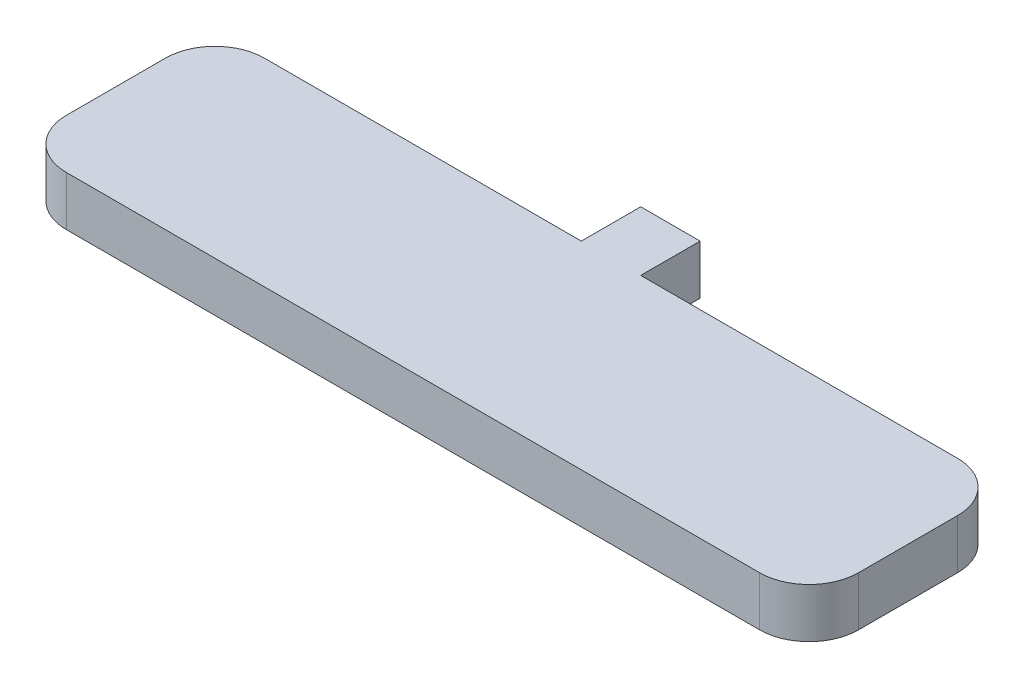
ISO-10303-21;
HEADER;
FILE_DESCRIPTION(('STEP AP214'),'2;1');
FILE_NAME('part.step','',(''),(''),'','','');
FILE_SCHEMA(('AUTOMOTIVE_DESIGN { 1 0 10303 214 1 1 1 1 }'));
ENDSEC;
DATA;
#1=APPLICATION_CONTEXT('core data for automotive mechanical design processes');
#2=APPLICATION_PROTOCOL_DEFINITION('international standard','automotive_design',2000,#1);
#3=PRODUCT_CONTEXT('',#1,'mechanical');
#4=PRODUCT('Part','Part','',(#3));
#5=PRODUCT_RELATED_PRODUCT_CATEGORY('part','',(#4));
#6=PRODUCT_DEFINITION_FORMATION('','',#4);
#7=PRODUCT_DEFINITION_CONTEXT('part definition',#1,'design');
#8=PRODUCT_DEFINITION('design','',#6,#7);
#9=PRODUCT_DEFINITION_SHAPE('','',#8);
#10=(LENGTH_UNIT() NAMED_UNIT(*) SI_UNIT(.MILLI.,.METRE.));
#11=(NAMED_UNIT(*) PLANE_ANGLE_UNIT() SI_UNIT($,.RADIAN.));
#12=(NAMED_UNIT(*) SI_UNIT($,.STERADIAN.) SOLID_ANGLE_UNIT());
#13=UNCERTAINTY_MEASURE_WITH_UNIT(LENGTH_MEASURE(1.E-05),#10,'distance_accuracy_value','');
#14=(GEOMETRIC_REPRESENTATION_CONTEXT(3) GLOBAL_UNCERTAINTY_ASSIGNED_CONTEXT((#13)) GLOBAL_UNIT_ASSIGNED_CONTEXT((#10,
#11,#12)) REPRESENTATION_CONTEXT('',''));
#15=CARTESIAN_POINT('',(0.,0.,0.));
#16=DIRECTION('',(0.,0.,1.));
#17=DIRECTION('',(1.,0.,0.));
#18=AXIS2_PLACEMENT_3D('',#15,#16,#17);
#19=CARTESIAN_POINT('',(-40.,5.,-10.));
#20=DIRECTION('',(0.,0.,1.));
#21=DIRECTION('',(1.,0.,0.));
#22=AXIS2_PLACEMENT_3D('',#19,#20,#21);
#23=PLANE('',#22);
#24=DIRECTION('',(0.,1.,0.));
#25=VECTOR('',#24,1.);
#26=CARTESIAN_POINT('',(-3.,4.99999999999999,-10.));
#27=LINE('',#26,#25);
#28=CARTESIAN_POINT('',(-3.,0.,-10.));
#29=VERTEX_POINT('',#28);
#30=CARTESIAN_POINT('',(-3.,5.,-10.));
#31=VERTEX_POINT('',#30);
#32=EDGE_CURVE('E55',#29,#31,#27,.T.);
#33=ORIENTED_EDGE('',*,*,#32,.F.);
#34=DIRECTION('',(-1.,0.,0.));
#35=VECTOR('',#34,1.);
#36=CARTESIAN_POINT('',(-40.,0.,-10.));
#37=LINE('',#36,#35);
#38=CARTESIAN_POINT('',(-35.,0.,-10.));
#39=VERTEX_POINT('',#38);
#40=EDGE_CURVE('E307',#29,#39,#37,.T.);
#41=ORIENTED_EDGE('',*,*,#40,.T.);
#42=DIRECTION('',(0.,-1.,0.));
#43=VECTOR('',#42,1.);
#44=CARTESIAN_POINT('',(-35.,5.,-10.));
#45=LINE('',#44,#43);
#46=CARTESIAN_POINT('',(-35.,5.,-10.));
#47=VERTEX_POINT('',#46);
#48=EDGE_CURVE('E342',#39,#47,#45,.F.);
#49=ORIENTED_EDGE('',*,*,#48,.T.);
#50=DIRECTION('',(-1.,0.,0.));
#51=VECTOR('',#50,1.);
#52=CARTESIAN_POINT('',(-40.,5.,-10.));
#53=LINE('',#52,#51);
#54=EDGE_CURVE('E290',#31,#47,#53,.T.);
#55=ORIENTED_EDGE('',*,*,#54,.F.);
#56=EDGE_LOOP('',(#33,#41,#49,#55));
#57=FACE_BOUND('',#56,.T.);
#58=ADVANCED_FACE('F39',(#57),#23,.F.);
#59=DIRECTION('',(0.,-1.,0.));
#60=VECTOR('',#59,1.);
#61=CARTESIAN_POINT('',(3.,4.99999999999999,-10.));
#62=LINE('',#61,#60);
#63=CARTESIAN_POINT('',(3.,4.99999999999999,-10.));
#64=VERTEX_POINT('',#63);
#65=CARTESIAN_POINT('',(3.,0.,-10.));
#66=VERTEX_POINT('',#65);
#67=EDGE_CURVE('E197',#64,#66,#62,.T.);
#68=ORIENTED_EDGE('',*,*,#67,.F.);
#69=CARTESIAN_POINT('',(35.,5.,-10.));
#70=VERTEX_POINT('',#69);
#71=EDGE_CURVE('E292',#70,#64,#53,.T.);
#72=ORIENTED_EDGE('',*,*,#71,.F.);
#73=DIRECTION('',(0.,-1.,0.));
#74=VECTOR('',#73,1.);
#75=CARTESIAN_POINT('',(35.,5.,-10.));
#76=LINE('',#75,#74);
#77=CARTESIAN_POINT('',(35.,0.,-10.));
#78=VERTEX_POINT('',#77);
#79=EDGE_CURVE('E338',#70,#78,#76,.T.);
#80=ORIENTED_EDGE('',*,*,#79,.T.);
#81=EDGE_CURVE('E308',#78,#66,#37,.T.);
#82=ORIENTED_EDGE('',*,*,#81,.T.);
#83=EDGE_LOOP('',(#68,#72,#80,#82));
#84=FACE_BOUND('',#83,.T.);
#85=ADVANCED_FACE('F388',(#84),#23,.F.);
#86=CARTESIAN_POINT('',(0.,0.,0.));
#87=DIRECTION('',(0.,1.,0.));
#88=DIRECTION('',(0.,0.,1.));
#89=AXIS2_PLACEMENT_3D('',#86,#87,#88);
#90=PLANE('',#89);
#91=DIRECTION('',(0.,0.,1.));
#92=VECTOR('',#91,1.);
#93=CARTESIAN_POINT('',(-40.,0.,-10.));
#94=LINE('',#93,#92);
#95=CARTESIAN_POINT('',(-40.,0.,-5.00000000000001));
#96=VERTEX_POINT('',#95);
#97=CARTESIAN_POINT('',(-40.,0.,4.99999999999999));
#98=VERTEX_POINT('',#97);
#99=EDGE_CURVE('E312',#96,#98,#94,.T.);
#100=ORIENTED_EDGE('',*,*,#99,.F.);
#101=CARTESIAN_POINT('',(-35.,0.,-5.00000000000001));
#102=DIRECTION('',(0.,1.,0.));
#103=DIRECTION('',(0.,0.,1.));
#104=AXIS2_PLACEMENT_3D('',#101,#102,#103);
#105=CIRCLE('',#104,5.);
#106=EDGE_CURVE('E334',#96,#39,#105,.F.);
#107=ORIENTED_EDGE('',*,*,#106,.T.);
#108=ORIENTED_EDGE('',*,*,#40,.F.);
#109=DIRECTION('',(0.,0.,1.));
#110=VECTOR('',#109,1.);
#111=CARTESIAN_POINT('',(-3.,0.,-16.));
#112=LINE('',#111,#110);
#113=CARTESIAN_POINT('',(-3.,0.,-16.));
#114=VERTEX_POINT('',#113);
#115=EDGE_CURVE('E407',#114,#29,#112,.T.);
#116=ORIENTED_EDGE('',*,*,#115,.F.);
#117=DIRECTION('',(-1.,0.,0.));
#118=VECTOR('',#117,1.);
#119=CARTESIAN_POINT('',(-3.,0.,-16.));
#120=LINE('',#119,#118);
#121=CARTESIAN_POINT('',(3.,0.,-16.));
#122=VERTEX_POINT('',#121);
#123=EDGE_CURVE('E194',#122,#114,#120,.T.);
#124=ORIENTED_EDGE('',*,*,#123,.F.);
#125=DIRECTION('',(0.,0.,1.));
#126=VECTOR('',#125,1.);
#127=CARTESIAN_POINT('',(3.,0.,-16.));
#128=LINE('',#127,#126);
#129=EDGE_CURVE('E208',#122,#66,#128,.T.);
#130=ORIENTED_EDGE('',*,*,#129,.T.);
#131=ORIENTED_EDGE('',*,*,#81,.F.);
#132=CARTESIAN_POINT('',(35.,0.,-5.00000000000001));
#133=DIRECTION('',(0.,1.,0.));
#134=DIRECTION('',(0.,0.,1.));
#135=AXIS2_PLACEMENT_3D('',#132,#133,#134);
#136=CIRCLE('',#135,5.);
#137=CARTESIAN_POINT('',(40.,0.,-5.00000000000001));
#138=VERTEX_POINT('',#137);
#139=EDGE_CURVE('E328',#78,#138,#136,.F.);
#140=ORIENTED_EDGE('',*,*,#139,.T.);
#141=DIRECTION('',(0.,0.,-1.));
#142=VECTOR('',#141,1.);
#143=CARTESIAN_POINT('',(40.,0.,-10.));
#144=LINE('',#143,#142);
#145=CARTESIAN_POINT('',(40.,0.,5.));
#146=VERTEX_POINT('',#145);
#147=EDGE_CURVE('E215',#146,#138,#144,.T.);
#148=ORIENTED_EDGE('',*,*,#147,.F.);
#149=CARTESIAN_POINT('',(35.,0.,4.99999999999999));
#150=DIRECTION('',(0.,1.,0.));
#151=DIRECTION('',(0.,0.,1.));
#152=AXIS2_PLACEMENT_3D('',#149,#150,#151);
#153=CIRCLE('',#152,5.);
#154=CARTESIAN_POINT('',(35.,0.,9.99999999999999));
#155=VERTEX_POINT('',#154);
#156=EDGE_CURVE('E325',#146,#155,#153,.F.);
#157=ORIENTED_EDGE('',*,*,#156,.T.);
#158=DIRECTION('',(1.,0.,0.));
#159=VECTOR('',#158,1.);
#160=CARTESIAN_POINT('',(-40.,0.,9.99999999999999));
#161=LINE('',#160,#159);
#162=CARTESIAN_POINT('',(-35.,0.,9.99999999999999));
#163=VERTEX_POINT('',#162);
#164=EDGE_CURVE('E291',#163,#155,#161,.T.);
#165=ORIENTED_EDGE('',*,*,#164,.F.);
#166=CARTESIAN_POINT('',(-35.,0.,4.99999999999999));
#167=DIRECTION('',(0.,1.,0.));
#168=DIRECTION('',(0.,0.,1.));
#169=AXIS2_PLACEMENT_3D('',#166,#167,#168);
#170=CIRCLE('',#169,5.);
#171=EDGE_CURVE('E331',#163,#98,#170,.F.);
#172=ORIENTED_EDGE('',*,*,#171,.T.);
#173=EDGE_LOOP('',(#100,#107,#108,#116,#124,#130,#131,#140,#148,#157,#165,#172));
#174=FACE_BOUND('',#173,.T.);
#175=CARTESIAN_POINT('',(-35.,0.,-5.00000000000001));
#176=DIRECTION('',(0.,1.,0.));
#177=DIRECTION('',(0.,0.,1.));
#178=AXIS2_PLACEMENT_3D('',#175,#176,#177);
#179=CIRCLE('',#178,3.);
#180=CARTESIAN_POINT('',(-38.,0.,-5.00000000000001));
#181=VERTEX_POINT('',#180);
#182=CARTESIAN_POINT('',(-35.,0.,-8.00000000000001));
#183=VERTEX_POINT('',#182);
#184=EDGE_CURVE('E256',#181,#183,#179,.F.);
#185=ORIENTED_EDGE('',*,*,#184,.F.);
#186=DIRECTION('',(0.,0.,1.));
#187=VECTOR('',#186,1.);
#188=CARTESIAN_POINT('',(-38.,0.,-10.));
#189=LINE('',#188,#187);
#190=CARTESIAN_POINT('',(-38.,0.,4.99999999999999));
#191=VERTEX_POINT('',#190);
#192=EDGE_CURVE('E272',#181,#191,#189,.T.);
#193=ORIENTED_EDGE('',*,*,#192,.T.);
#194=CARTESIAN_POINT('',(-35.,0.,4.99999999999999));
#195=DIRECTION('',(0.,1.,0.));
#196=DIRECTION('',(0.,0.,1.));
#197=AXIS2_PLACEMENT_3D('',#194,#195,#196);
#198=CIRCLE('',#197,3.);
#199=CARTESIAN_POINT('',(-35.,0.,7.99999999999999));
#200=VERTEX_POINT('',#199);
#201=EDGE_CURVE('E273',#200,#191,#198,.F.);
#202=ORIENTED_EDGE('',*,*,#201,.F.);
#203=DIRECTION('',(1.,0.,0.));
#204=VECTOR('',#203,1.);
#205=CARTESIAN_POINT('',(-40.,0.,7.99999999999999));
#206=LINE('',#205,#204);
#207=CARTESIAN_POINT('',(35.,0.,7.99999999999999));
#208=VERTEX_POINT('',#207);
#209=EDGE_CURVE('E63',#200,#208,#206,.T.);
#210=ORIENTED_EDGE('',*,*,#209,.T.);
#211=CARTESIAN_POINT('',(35.,0.,4.99999999999999));
#212=DIRECTION('',(0.,1.,0.));
#213=DIRECTION('',(0.,0.,1.));
#214=AXIS2_PLACEMENT_3D('',#211,#212,#213);
#215=CIRCLE('',#214,3.);
#216=CARTESIAN_POINT('',(38.,0.,4.99999999999999));
#217=VERTEX_POINT('',#216);
#218=EDGE_CURVE('E260',#217,#208,#215,.F.);
#219=ORIENTED_EDGE('',*,*,#218,.F.);
#220=DIRECTION('',(0.,0.,-1.));
#221=VECTOR('',#220,1.);
#222=CARTESIAN_POINT('',(38.,0.,-10.));
#223=LINE('',#222,#221);
#224=CARTESIAN_POINT('',(38.,0.,-5.00000000000001));
#225=VERTEX_POINT('',#224);
#226=EDGE_CURVE('E201',#217,#225,#223,.T.);
#227=ORIENTED_EDGE('',*,*,#226,.T.);
#228=CARTESIAN_POINT('',(35.,0.,-5.00000000000001));
#229=DIRECTION('',(0.,1.,0.));
#230=DIRECTION('',(0.,0.,1.));
#231=AXIS2_PLACEMENT_3D('',#228,#229,#230);
#232=CIRCLE('',#231,3.);
#233=CARTESIAN_POINT('',(35.,0.,-8.00000000000001));
#234=VERTEX_POINT('',#233);
#235=EDGE_CURVE('E269',#234,#225,#232,.F.);
#236=ORIENTED_EDGE('',*,*,#235,.F.);
#237=DIRECTION('',(-1.,0.,0.));
#238=VECTOR('',#237,1.);
#239=CARTESIAN_POINT('',(-40.,0.,-8.00000000000001));
#240=LINE('',#239,#238);
#241=EDGE_CURVE('E206',#234,#183,#240,.T.);
#242=ORIENTED_EDGE('',*,*,#241,.T.);
#243=EDGE_LOOP('',(#185,#193,#202,#210,#219,#227,#236,#242));
#244=FACE_BOUND('',#243,.T.);
#245=ADVANCED_FACE('F376',(#174,#244),#90,.F.);
#246=CARTESIAN_POINT('',(40.,5.,-10.));
#247=DIRECTION('',(-1.,0.,0.));
#248=DIRECTION('',(0.,0.,1.));
#249=AXIS2_PLACEMENT_3D('',#246,#247,#248);
#250=PLANE('',#249);
#251=ORIENTED_EDGE('',*,*,#147,.T.);
#252=DIRECTION('',(0.,-1.,0.));
#253=VECTOR('',#252,1.);
#254=CARTESIAN_POINT('',(40.,5.,-5.00000000000001));
#255=LINE('',#254,#253);
#256=CARTESIAN_POINT('',(40.,5.,-5.00000000000001));
#257=VERTEX_POINT('',#256);
#258=EDGE_CURVE('E11',#138,#257,#255,.F.);
#259=ORIENTED_EDGE('',*,*,#258,.T.);
#260=DIRECTION('',(0.,0.,-1.));
#261=VECTOR('',#260,1.);
#262=CARTESIAN_POINT('',(40.,5.,-10.));
#263=LINE('',#262,#261);
#264=CARTESIAN_POINT('',(40.,5.,5.));
#265=VERTEX_POINT('',#264);
#266=EDGE_CURVE('E286',#265,#257,#263,.T.);
#267=ORIENTED_EDGE('',*,*,#266,.F.);
#268=DIRECTION('',(0.,-1.,0.));
#269=VECTOR('',#268,1.);
#270=CARTESIAN_POINT('',(40.,5.,5.));
#271=LINE('',#270,#269);
#272=EDGE_CURVE('E48',#265,#146,#271,.T.);
#273=ORIENTED_EDGE('',*,*,#272,.T.);
#274=EDGE_LOOP('',(#251,#259,#267,#273));
#275=FACE_BOUND('',#274,.T.);
#276=ADVANCED_FACE('F370',(#275),#250,.F.);
#277=CARTESIAN_POINT('',(-40.,5.,-10.));
#278=DIRECTION('',(1.,0.,0.));
#279=DIRECTION('',(0.,0.,-1.));
#280=AXIS2_PLACEMENT_3D('',#277,#278,#279);
#281=PLANE('',#280);
#282=DIRECTION('',(0.,0.,1.));
#283=VECTOR('',#282,1.);
#284=CARTESIAN_POINT('',(-40.,5.,-10.));
#285=LINE('',#284,#283);
#286=CARTESIAN_POINT('',(-40.,5.,-5.00000000000001));
#287=VERTEX_POINT('',#286);
#288=CARTESIAN_POINT('',(-40.,5.,4.99999999999999));
#289=VERTEX_POINT('',#288);
#290=EDGE_CURVE('E295',#287,#289,#285,.T.);
#291=ORIENTED_EDGE('',*,*,#290,.F.);
#292=DIRECTION('',(0.,-1.,0.));
#293=VECTOR('',#292,1.);
#294=CARTESIAN_POINT('',(-40.,5.,-5.00000000000001));
#295=LINE('',#294,#293);
#296=EDGE_CURVE('E321',#287,#96,#295,.T.);
#297=ORIENTED_EDGE('',*,*,#296,.T.);
#298=ORIENTED_EDGE('',*,*,#99,.T.);
#299=DIRECTION('',(0.,-1.,0.));
#300=VECTOR('',#299,1.);
#301=CARTESIAN_POINT('',(-40.,5.,4.99999999999999));
#302=LINE('',#301,#300);
#303=EDGE_CURVE('E303',#98,#289,#302,.F.);
#304=ORIENTED_EDGE('',*,*,#303,.T.);
#305=EDGE_LOOP('',(#291,#297,#298,#304));
#306=FACE_BOUND('',#305,.T.);
#307=ADVANCED_FACE('F398',(#306),#281,.F.);
#308=CARTESIAN_POINT('',(-40.,5.,9.99999999999999));
#309=DIRECTION('',(0.,0.,-1.));
#310=DIRECTION('',(-1.,0.,0.));
#311=AXIS2_PLACEMENT_3D('',#308,#309,#310);
#312=PLANE('',#311);
#313=DIRECTION('',(1.,0.,0.));
#314=VECTOR('',#313,1.);
#315=CARTESIAN_POINT('',(-40.,5.,9.99999999999999));
#316=LINE('',#315,#314);
#317=CARTESIAN_POINT('',(-35.,5.,9.99999999999999));
#318=VERTEX_POINT('',#317);
#319=CARTESIAN_POINT('',(35.,5.,9.99999999999999));
#320=VERTEX_POINT('',#319);
#321=EDGE_CURVE('E299',#318,#320,#316,.T.);
#322=ORIENTED_EDGE('',*,*,#321,.F.);
#323=DIRECTION('',(0.,-1.,0.));
#324=VECTOR('',#323,1.);
#325=CARTESIAN_POINT('',(-35.,5.,9.99999999999999));
#326=LINE('',#325,#324);
#327=EDGE_CURVE('E361',#318,#163,#326,.T.);
#328=ORIENTED_EDGE('',*,*,#327,.T.);
#329=ORIENTED_EDGE('',*,*,#164,.T.);
#330=DIRECTION('',(0.,-1.,0.));
#331=VECTOR('',#330,1.);
#332=CARTESIAN_POINT('',(35.,5.,9.99999999999999));
#333=LINE('',#332,#331);
#334=EDGE_CURVE('E358',#155,#320,#333,.F.);
#335=ORIENTED_EDGE('',*,*,#334,.T.);
#336=EDGE_LOOP('',(#322,#328,#329,#335));
#337=FACE_BOUND('',#336,.T.);
#338=ADVANCED_FACE('F392',(#337),#312,.F.);
#339=CARTESIAN_POINT('',(0.,5.,0.));
#340=DIRECTION('',(0.,1.,0.));
#341=DIRECTION('',(0.,0.,1.));
#342=AXIS2_PLACEMENT_3D('',#339,#340,#341);
#343=PLANE('',#342);
#344=ORIENTED_EDGE('',*,*,#71,.T.);
#345=DIRECTION('',(0.,0.,1.));
#346=VECTOR('',#345,1.);
#347=CARTESIAN_POINT('',(3.,4.99999999999999,-16.));
#348=LINE('',#347,#346);
#349=CARTESIAN_POINT('',(3.,4.99999999999999,-16.));
#350=VERTEX_POINT('',#349);
#351=EDGE_CURVE('E184',#350,#64,#348,.T.);
#352=ORIENTED_EDGE('',*,*,#351,.F.);
#353=DIRECTION('',(1.,0.,0.));
#354=VECTOR('',#353,1.);
#355=CARTESIAN_POINT('',(-3.,4.99999999999999,-16.));
#356=LINE('',#355,#354);
#357=CARTESIAN_POINT('',(-3.,4.99999999999999,-16.));
#358=VERTEX_POINT('',#357);
#359=EDGE_CURVE('E178',#358,#350,#356,.T.);
#360=ORIENTED_EDGE('',*,*,#359,.F.);
#361=DIRECTION('',(0.,0.,1.));
#362=VECTOR('',#361,1.);
#363=CARTESIAN_POINT('',(-3.,4.99999999999999,-16.));
#364=LINE('',#363,#362);
#365=EDGE_CURVE('E182',#358,#31,#364,.T.);
#366=ORIENTED_EDGE('',*,*,#365,.T.);
#367=ORIENTED_EDGE('',*,*,#54,.T.);
#368=CARTESIAN_POINT('',(-35.,5.,-5.00000000000001));
#369=DIRECTION('',(0.,1.,0.));
#370=DIRECTION('',(0.,0.,1.));
#371=AXIS2_PLACEMENT_3D('',#368,#369,#370);
#372=CIRCLE('',#371,5.);
#373=EDGE_CURVE('E355',#47,#287,#372,.T.);
#374=ORIENTED_EDGE('',*,*,#373,.T.);
#375=ORIENTED_EDGE('',*,*,#290,.T.);
#376=CARTESIAN_POINT('',(-35.,5.,4.99999999999999));
#377=DIRECTION('',(0.,1.,0.));
#378=DIRECTION('',(0.,0.,1.));
#379=AXIS2_PLACEMENT_3D('',#376,#377,#378);
#380=CIRCLE('',#379,5.);
#381=EDGE_CURVE('E352',#289,#318,#380,.T.);
#382=ORIENTED_EDGE('',*,*,#381,.T.);
#383=ORIENTED_EDGE('',*,*,#321,.T.);
#384=CARTESIAN_POINT('',(35.,5.,4.99999999999999));
#385=DIRECTION('',(0.,1.,0.));
#386=DIRECTION('',(0.,0.,1.));
#387=AXIS2_PLACEMENT_3D('',#384,#385,#386);
#388=CIRCLE('',#387,5.);
#389=EDGE_CURVE('E346',#320,#265,#388,.T.);
#390=ORIENTED_EDGE('',*,*,#389,.T.);
#391=ORIENTED_EDGE('',*,*,#266,.T.);
#392=CARTESIAN_POINT('',(35.,5.,-5.00000000000001));
#393=DIRECTION('',(0.,1.,0.));
#394=DIRECTION('',(0.,0.,1.));
#395=AXIS2_PLACEMENT_3D('',#392,#393,#394);
#396=CIRCLE('',#395,5.);
#397=EDGE_CURVE('E349',#257,#70,#396,.T.);
#398=ORIENTED_EDGE('',*,*,#397,.T.);
#399=EDGE_LOOP('',(#344,#352,#360,#366,#367,#374,#375,#382,#383,#390,#391,#398));
#400=FACE_BOUND('',#399,.T.);
#401=ADVANCED_FACE('F181',(#400),#343,.T.);
#402=CARTESIAN_POINT('',(-35.,5.,-5.00000000000001));
#403=DIRECTION('',(0.,-1.,0.));
#404=DIRECTION('',(0.,0.,-1.));
#405=AXIS2_PLACEMENT_3D('',#402,#403,#404);
#406=CYLINDRICAL_SURFACE('',#405,5.);
#407=ORIENTED_EDGE('',*,*,#373,.F.);
#408=ORIENTED_EDGE('',*,*,#48,.F.);
#409=ORIENTED_EDGE('',*,*,#106,.F.);
#410=ORIENTED_EDGE('',*,*,#296,.F.);
#411=EDGE_LOOP('',(#407,#408,#409,#410));
#412=FACE_BOUND('',#411,.T.);
#413=ADVANCED_FACE('F404',(#412),#406,.T.);
#414=CARTESIAN_POINT('',(-35.,5.,4.99999999999999));
#415=DIRECTION('',(0.,-1.,0.));
#416=DIRECTION('',(0.,0.,-1.));
#417=AXIS2_PLACEMENT_3D('',#414,#415,#416);
#418=CYLINDRICAL_SURFACE('',#417,5.);
#419=ORIENTED_EDGE('',*,*,#381,.F.);
#420=ORIENTED_EDGE('',*,*,#303,.F.);
#421=ORIENTED_EDGE('',*,*,#171,.F.);
#422=ORIENTED_EDGE('',*,*,#327,.F.);
#423=EDGE_LOOP('',(#419,#420,#421,#422));
#424=FACE_BOUND('',#423,.T.);
#425=ADVANCED_FACE('F401',(#424),#418,.T.);
#426=CARTESIAN_POINT('',(35.,5.,-5.00000000000001));
#427=DIRECTION('',(0.,-1.,0.));
#428=DIRECTION('',(0.,0.,-1.));
#429=AXIS2_PLACEMENT_3D('',#426,#427,#428);
#430=CYLINDRICAL_SURFACE('',#429,5.);
#431=ORIENTED_EDGE('',*,*,#397,.F.);
#432=ORIENTED_EDGE('',*,*,#258,.F.);
#433=ORIENTED_EDGE('',*,*,#139,.F.);
#434=ORIENTED_EDGE('',*,*,#79,.F.);
#435=EDGE_LOOP('',(#431,#432,#433,#434));
#436=FACE_BOUND('',#435,.T.);
#437=ADVANCED_FACE('F384',(#436),#430,.T.);
#438=CARTESIAN_POINT('',(35.,5.,4.99999999999999));
#439=DIRECTION('',(0.,-1.,0.));
#440=DIRECTION('',(0.,0.,-1.));
#441=AXIS2_PLACEMENT_3D('',#438,#439,#440);
#442=CYLINDRICAL_SURFACE('',#441,5.);
#443=ORIENTED_EDGE('',*,*,#389,.F.);
#444=ORIENTED_EDGE('',*,*,#334,.F.);
#445=ORIENTED_EDGE('',*,*,#156,.F.);
#446=ORIENTED_EDGE('',*,*,#272,.F.);
#447=EDGE_LOOP('',(#443,#444,#445,#446));
#448=FACE_BOUND('',#447,.T.);
#449=ADVANCED_FACE('F41',(#448),#442,.T.);
#450=CARTESIAN_POINT('',(38.,5.,-10.));
#451=DIRECTION('',(-1.,0.,0.));
#452=DIRECTION('',(0.,0.,1.));
#453=AXIS2_PLACEMENT_3D('',#450,#451,#452);
#454=PLANE('',#453);
#455=ORIENTED_EDGE('',*,*,#226,.F.);
#456=DIRECTION('',(0.,1.,0.));
#457=VECTOR('',#456,1.);
#458=CARTESIAN_POINT('',(38.,5.,5.));
#459=LINE('',#458,#457);
#460=CARTESIAN_POINT('',(38.,3.,5.));
#461=VERTEX_POINT('',#460);
#462=EDGE_CURVE('E216',#461,#217,#459,.F.);
#463=ORIENTED_EDGE('',*,*,#462,.F.);
#464=DIRECTION('',(0.,0.,-1.));
#465=VECTOR('',#464,1.);
#466=CARTESIAN_POINT('',(38.,3.,-10.));
#467=LINE('',#466,#465);
#468=CARTESIAN_POINT('',(38.,3.,-5.00000000000001));
#469=VERTEX_POINT('',#468);
#470=EDGE_CURVE('E217',#461,#469,#467,.T.);
#471=ORIENTED_EDGE('',*,*,#470,.T.);
#472=DIRECTION('',(0.,1.,0.));
#473=VECTOR('',#472,1.);
#474=CARTESIAN_POINT('',(38.,5.,-5.00000000000001));
#475=LINE('',#474,#473);
#476=EDGE_CURVE('E212',#225,#469,#475,.T.);
#477=ORIENTED_EDGE('',*,*,#476,.F.);
#478=EDGE_LOOP('',(#455,#463,#471,#477));
#479=FACE_BOUND('',#478,.T.);
#480=ADVANCED_FACE('F428',(#479),#454,.T.);
#481=CARTESIAN_POINT('',(-40.,5.,-8.00000000000001));
#482=DIRECTION('',(0.,0.,1.));
#483=DIRECTION('',(1.,0.,0.));
#484=AXIS2_PLACEMENT_3D('',#481,#482,#483);
#485=PLANE('',#484);
#486=ORIENTED_EDGE('',*,*,#241,.F.);
#487=DIRECTION('',(0.,1.,0.));
#488=VECTOR('',#487,1.);
#489=CARTESIAN_POINT('',(35.,5.,-8.00000000000001));
#490=LINE('',#489,#488);
#491=CARTESIAN_POINT('',(35.,3.,-8.00000000000001));
#492=VERTEX_POINT('',#491);
#493=EDGE_CURVE('E253',#492,#234,#490,.F.);
#494=ORIENTED_EDGE('',*,*,#493,.F.);
#495=DIRECTION('',(-1.,0.,0.));
#496=VECTOR('',#495,1.);
#497=CARTESIAN_POINT('',(-40.,3.,-8.00000000000001));
#498=LINE('',#497,#496);
#499=CARTESIAN_POINT('',(-35.,3.,-8.00000000000001));
#500=VERTEX_POINT('',#499);
#501=EDGE_CURVE('E221',#492,#500,#498,.T.);
#502=ORIENTED_EDGE('',*,*,#501,.T.);
#503=DIRECTION('',(0.,1.,0.));
#504=VECTOR('',#503,1.);
#505=CARTESIAN_POINT('',(-35.,5.,-8.00000000000001));
#506=LINE('',#505,#504);
#507=EDGE_CURVE('E248',#183,#500,#506,.T.);
#508=ORIENTED_EDGE('',*,*,#507,.F.);
#509=EDGE_LOOP('',(#486,#494,#502,#508));
#510=FACE_BOUND('',#509,.T.);
#511=ADVANCED_FACE('F432',(#510),#485,.T.);
#512=CARTESIAN_POINT('',(-38.,5.,-10.));
#513=DIRECTION('',(1.,0.,0.));
#514=DIRECTION('',(0.,0.,-1.));
#515=AXIS2_PLACEMENT_3D('',#512,#513,#514);
#516=PLANE('',#515);
#517=DIRECTION('',(0.,0.,1.));
#518=VECTOR('',#517,1.);
#519=CARTESIAN_POINT('',(-38.,3.,-10.));
#520=LINE('',#519,#518);
#521=CARTESIAN_POINT('',(-38.,3.,-5.00000000000001));
#522=VERTEX_POINT('',#521);
#523=CARTESIAN_POINT('',(-38.,3.,4.99999999999999));
#524=VERTEX_POINT('',#523);
#525=EDGE_CURVE('E228',#522,#524,#520,.T.);
#526=ORIENTED_EDGE('',*,*,#525,.T.);
#527=DIRECTION('',(0.,1.,0.));
#528=VECTOR('',#527,1.);
#529=CARTESIAN_POINT('',(-38.,5.,4.99999999999999));
#530=LINE('',#529,#528);
#531=EDGE_CURVE('E244',#191,#524,#530,.T.);
#532=ORIENTED_EDGE('',*,*,#531,.F.);
#533=ORIENTED_EDGE('',*,*,#192,.F.);
#534=DIRECTION('',(0.,1.,0.));
#535=VECTOR('',#534,1.);
#536=CARTESIAN_POINT('',(-38.,5.,-5.00000000000001));
#537=LINE('',#536,#535);
#538=EDGE_CURVE('E257',#522,#181,#537,.F.);
#539=ORIENTED_EDGE('',*,*,#538,.F.);
#540=EDGE_LOOP('',(#526,#532,#533,#539));
#541=FACE_BOUND('',#540,.T.);
#542=ADVANCED_FACE('F438',(#541),#516,.T.);
#543=CARTESIAN_POINT('',(-40.,5.,7.99999999999999));
#544=DIRECTION('',(0.,0.,-1.));
#545=DIRECTION('',(-1.,0.,0.));
#546=AXIS2_PLACEMENT_3D('',#543,#544,#545);
#547=PLANE('',#546);
#548=DIRECTION('',(1.,0.,0.));
#549=VECTOR('',#548,1.);
#550=CARTESIAN_POINT('',(-40.,3.,7.99999999999999));
#551=LINE('',#550,#549);
#552=CARTESIAN_POINT('',(-35.,3.,7.99999999999999));
#553=VERTEX_POINT('',#552);
#554=CARTESIAN_POINT('',(35.,3.,7.99999999999999));
#555=VERTEX_POINT('',#554);
#556=EDGE_CURVE('E237',#553,#555,#551,.T.);
#557=ORIENTED_EDGE('',*,*,#556,.T.);
#558=DIRECTION('',(0.,1.,0.));
#559=VECTOR('',#558,1.);
#560=CARTESIAN_POINT('',(35.,5.,7.99999999999999));
#561=LINE('',#560,#559);
#562=EDGE_CURVE('E232',#208,#555,#561,.T.);
#563=ORIENTED_EDGE('',*,*,#562,.F.);
#564=ORIENTED_EDGE('',*,*,#209,.F.);
#565=DIRECTION('',(0.,1.,0.));
#566=VECTOR('',#565,1.);
#567=CARTESIAN_POINT('',(-35.,5.,7.99999999999999));
#568=LINE('',#567,#566);
#569=EDGE_CURVE('E224',#553,#200,#568,.F.);
#570=ORIENTED_EDGE('',*,*,#569,.F.);
#571=EDGE_LOOP('',(#557,#563,#564,#570));
#572=FACE_BOUND('',#571,.T.);
#573=ADVANCED_FACE('F447',(#572),#547,.T.);
#574=CARTESIAN_POINT('',(0.,3.,0.));
#575=DIRECTION('',(0.,1.,0.));
#576=DIRECTION('',(0.,0.,1.));
#577=AXIS2_PLACEMENT_3D('',#574,#575,#576);
#578=PLANE('',#577);
#579=ORIENTED_EDGE('',*,*,#501,.F.);
#580=CARTESIAN_POINT('',(35.,3.,-5.00000000000001));
#581=DIRECTION('',(0.,1.,0.));
#582=DIRECTION('',(0.,0.,1.));
#583=AXIS2_PLACEMENT_3D('',#580,#581,#582);
#584=CIRCLE('',#583,3.);
#585=EDGE_CURVE('E240',#469,#492,#584,.T.);
#586=ORIENTED_EDGE('',*,*,#585,.F.);
#587=ORIENTED_EDGE('',*,*,#470,.F.);
#588=CARTESIAN_POINT('',(35.,3.,4.99999999999999));
#589=DIRECTION('',(0.,1.,0.));
#590=DIRECTION('',(0.,0.,1.));
#591=AXIS2_PLACEMENT_3D('',#588,#589,#590);
#592=CIRCLE('',#591,3.);
#593=EDGE_CURVE('E245',#555,#461,#592,.T.);
#594=ORIENTED_EDGE('',*,*,#593,.F.);
#595=ORIENTED_EDGE('',*,*,#556,.F.);
#596=CARTESIAN_POINT('',(-35.,3.,4.99999999999999));
#597=DIRECTION('',(0.,1.,0.));
#598=DIRECTION('',(0.,0.,1.));
#599=AXIS2_PLACEMENT_3D('',#596,#597,#598);
#600=CIRCLE('',#599,3.);
#601=EDGE_CURVE('E233',#524,#553,#600,.T.);
#602=ORIENTED_EDGE('',*,*,#601,.F.);
#603=ORIENTED_EDGE('',*,*,#525,.F.);
#604=CARTESIAN_POINT('',(-35.,3.,-5.00000000000001));
#605=DIRECTION('',(0.,1.,0.));
#606=DIRECTION('',(0.,0.,1.));
#607=AXIS2_PLACEMENT_3D('',#604,#605,#606);
#608=CIRCLE('',#607,3.);
#609=EDGE_CURVE('E229',#500,#522,#608,.T.);
#610=ORIENTED_EDGE('',*,*,#609,.F.);
#611=EDGE_LOOP('',(#579,#586,#587,#594,#595,#602,#603,#610));
#612=FACE_BOUND('',#611,.T.);
#613=ADVANCED_FACE('F451',(#612),#578,.F.);
#614=CARTESIAN_POINT('',(-35.,5.,-5.00000000000001));
#615=DIRECTION('',(0.,-1.,0.));
#616=DIRECTION('',(0.,0.,-1.));
#617=AXIS2_PLACEMENT_3D('',#614,#615,#616);
#618=CYLINDRICAL_SURFACE('',#617,3.);
#619=ORIENTED_EDGE('',*,*,#609,.T.);
#620=ORIENTED_EDGE('',*,*,#538,.T.);
#621=ORIENTED_EDGE('',*,*,#184,.T.);
#622=ORIENTED_EDGE('',*,*,#507,.T.);
#623=EDGE_LOOP('',(#619,#620,#621,#622));
#624=FACE_BOUND('',#623,.T.);
#625=ADVANCED_FACE('F454',(#624),#618,.F.);
#626=CARTESIAN_POINT('',(-35.,5.,4.99999999999999));
#627=DIRECTION('',(0.,-1.,0.));
#628=DIRECTION('',(0.,0.,-1.));
#629=AXIS2_PLACEMENT_3D('',#626,#627,#628);
#630=CYLINDRICAL_SURFACE('',#629,3.);
#631=ORIENTED_EDGE('',*,*,#601,.T.);
#632=ORIENTED_EDGE('',*,*,#569,.T.);
#633=ORIENTED_EDGE('',*,*,#201,.T.);
#634=ORIENTED_EDGE('',*,*,#531,.T.);
#635=EDGE_LOOP('',(#631,#632,#633,#634));
#636=FACE_BOUND('',#635,.T.);
#637=ADVANCED_FACE('F458',(#636),#630,.F.);
#638=CARTESIAN_POINT('',(35.,5.,-5.00000000000001));
#639=DIRECTION('',(0.,-1.,0.));
#640=DIRECTION('',(0.,0.,-1.));
#641=AXIS2_PLACEMENT_3D('',#638,#639,#640);
#642=CYLINDRICAL_SURFACE('',#641,3.);
#643=ORIENTED_EDGE('',*,*,#585,.T.);
#644=ORIENTED_EDGE('',*,*,#493,.T.);
#645=ORIENTED_EDGE('',*,*,#235,.T.);
#646=ORIENTED_EDGE('',*,*,#476,.T.);
#647=EDGE_LOOP('',(#643,#644,#645,#646));
#648=FACE_BOUND('',#647,.T.);
#649=ADVANCED_FACE('F462',(#648),#642,.F.);
#650=CARTESIAN_POINT('',(35.,5.,4.99999999999999));
#651=DIRECTION('',(0.,-1.,0.));
#652=DIRECTION('',(0.,0.,-1.));
#653=AXIS2_PLACEMENT_3D('',#650,#651,#652);
#654=CYLINDRICAL_SURFACE('',#653,3.);
#655=ORIENTED_EDGE('',*,*,#593,.T.);
#656=ORIENTED_EDGE('',*,*,#462,.T.);
#657=ORIENTED_EDGE('',*,*,#218,.T.);
#658=ORIENTED_EDGE('',*,*,#562,.T.);
#659=EDGE_LOOP('',(#655,#656,#657,#658));
#660=FACE_BOUND('',#659,.T.);
#661=ADVANCED_FACE('F466',(#660),#654,.F.);
#662=CARTESIAN_POINT('',(-3.,4.99999999999999,-16.));
#663=DIRECTION('',(1.,0.,0.));
#664=DIRECTION('',(0.,1.,0.));
#665=AXIS2_PLACEMENT_3D('',#662,#663,#664);
#666=PLANE('',#665);
#667=ORIENTED_EDGE('',*,*,#32,.T.);
#668=ORIENTED_EDGE('',*,*,#365,.F.);
#669=DIRECTION('',(0.,1.,0.));
#670=VECTOR('',#669,1.);
#671=CARTESIAN_POINT('',(-3.,4.99999999999999,-16.));
#672=LINE('',#671,#670);
#673=EDGE_CURVE('E189',#114,#358,#672,.T.);
#674=ORIENTED_EDGE('',*,*,#673,.F.);
#675=ORIENTED_EDGE('',*,*,#115,.T.);
#676=EDGE_LOOP('',(#667,#668,#674,#675));
#677=FACE_BOUND('',#676,.T.);
#678=ADVANCED_FACE('F199',(#677),#666,.F.);
#679=CARTESIAN_POINT('',(3.,4.99999999999999,-16.));
#680=DIRECTION('',(-1.,0.,0.));
#681=DIRECTION('',(0.,-1.,0.));
#682=AXIS2_PLACEMENT_3D('',#679,#680,#681);
#683=PLANE('',#682);
#684=ORIENTED_EDGE('',*,*,#67,.T.);
#685=ORIENTED_EDGE('',*,*,#129,.F.);
#686=DIRECTION('',(0.,-1.,0.));
#687=VECTOR('',#686,1.);
#688=CARTESIAN_POINT('',(3.,4.99999999999999,-16.));
#689=LINE('',#688,#687);
#690=EDGE_CURVE('E188',#350,#122,#689,.T.);
#691=ORIENTED_EDGE('',*,*,#690,.F.);
#692=ORIENTED_EDGE('',*,*,#351,.T.);
#693=EDGE_LOOP('',(#684,#685,#691,#692));
#694=FACE_BOUND('',#693,.T.);
#695=ADVANCED_FACE('F595',(#694),#683,.F.);
#696=CARTESIAN_POINT('',(0.,0.,-16.));
#697=DIRECTION('',(0.,0.,1.));
#698=DIRECTION('',(1.,0.,0.));
#699=AXIS2_PLACEMENT_3D('',#696,#697,#698);
#700=PLANE('',#699);
#701=CARTESIAN_POINT('',(0.,2.5,-16.));
#702=DIRECTION('',(0.,0.,-1.));
#703=DIRECTION('',(-1.,0.,0.));
#704=AXIS2_PLACEMENT_3D('',#701,#702,#703);
#705=CIRCLE('',#704,1.425);
#706=CARTESIAN_POINT('',(-1.425,2.5,-16.));
#707=VERTEX_POINT('',#706);
#708=EDGE_CURVE('E638',#707,#707,#705,.T.);
#709=ORIENTED_EDGE('',*,*,#708,.F.);
#710=EDGE_LOOP('',(#709));
#711=FACE_BOUND('',#710,.T.);
#712=ORIENTED_EDGE('',*,*,#673,.T.);
#713=ORIENTED_EDGE('',*,*,#359,.T.);
#714=ORIENTED_EDGE('',*,*,#690,.T.);
#715=ORIENTED_EDGE('',*,*,#123,.T.);
#716=EDGE_LOOP('',(#712,#713,#714,#715));
#717=FACE_BOUND('',#716,.T.);
#718=ADVANCED_FACE('F192',(#711,#717),#700,.F.);
#719=CARTESIAN_POINT('',(0.,2.5,-12.));
#720=DIRECTION('',(0.,0.,-1.));
#721=DIRECTION('',(-1.,0.,0.));
#722=AXIS2_PLACEMENT_3D('',#719,#720,#721);
#723=CYLINDRICAL_SURFACE('',#722,1.425);
#724=CARTESIAN_POINT('',(0.,2.5,-12.));
#725=DIRECTION('',(0.,0.,-1.));
#726=DIRECTION('',(-1.,0.,0.));
#727=AXIS2_PLACEMENT_3D('',#724,#725,#726);
#728=CIRCLE('',#727,1.425);
#729=CARTESIAN_POINT('',(-1.425,2.5,-12.));
#730=VERTEX_POINT('',#729);
#731=EDGE_CURVE('E636',#730,#730,#728,.T.);
#732=ORIENTED_EDGE('',*,*,#731,.F.);
#733=EDGE_LOOP('',(#732));
#734=FACE_BOUND('',#733,.T.);
#735=ORIENTED_EDGE('',*,*,#708,.T.);
#736=EDGE_LOOP('',(#735));
#737=FACE_BOUND('',#736,.T.);
#738=ADVANCED_FACE('F609',(#734,#737),#723,.F.);
#739=CARTESIAN_POINT('',(0.,2.5,-12.));
#740=DIRECTION('',(0.,0.,-1.));
#741=DIRECTION('',(-1.,0.,0.));
#742=AXIS2_PLACEMENT_3D('',#739,#740,#741);
#743=PLANE('',#742);
#744=ORIENTED_EDGE('',*,*,#731,.T.);
#745=EDGE_LOOP('',(#744));
#746=FACE_BOUND('',#745,.T.);
#747=ADVANCED_FACE('F618',(#746),#743,.T.);
#748=CLOSED_SHELL('',(#58,#85,#245,#276,#307,#338,#401,#413,#425,#437,#449,#480,#511,#542,#573,
#613,#625,#637,#649,#661,#678,#695,#718,#738,#747));
#749=MANIFOLD_SOLID_BREP('B2',#748);
#750=ADVANCED_BREP_SHAPE_REPRESENTATION('',(#18,#749),#14);
#751=SHAPE_DEFINITION_REPRESENTATION(#9,#750);
ENDSEC;
END-ISO-10303-21;
